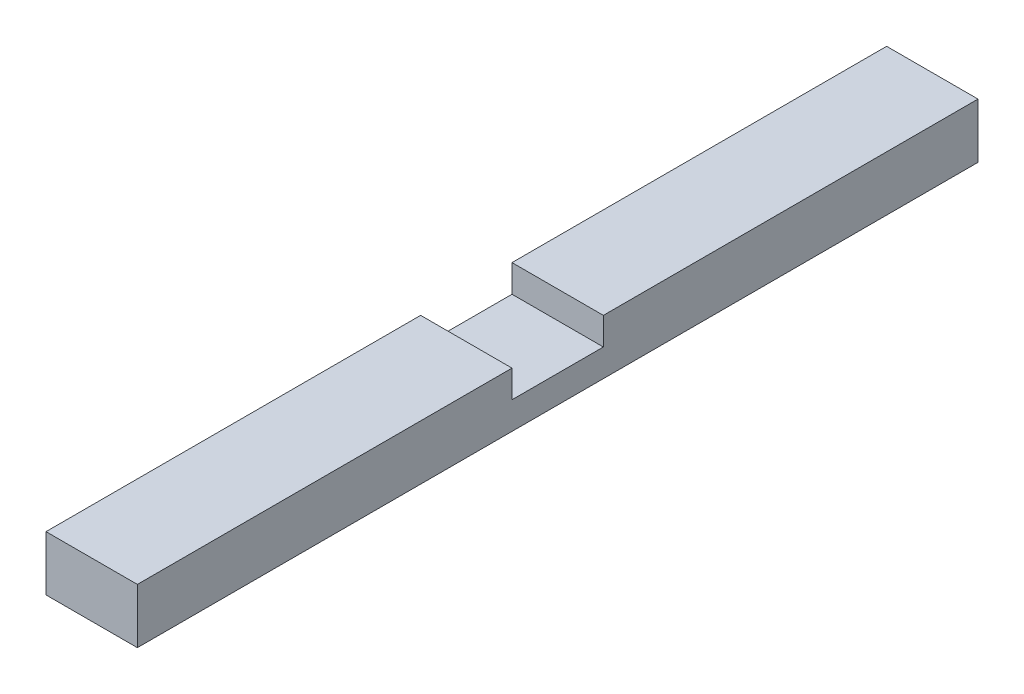
ISO-10303-21;
HEADER;
FILE_DESCRIPTION(('STEP AP214'),'2;1');
FILE_NAME('part.step','',(''),(''),'','','');
FILE_SCHEMA(('AUTOMOTIVE_DESIGN { 1 0 10303 214 1 1 1 1 }'));
ENDSEC;
DATA;
#1=APPLICATION_CONTEXT('core data for automotive mechanical design processes');
#2=APPLICATION_PROTOCOL_DEFINITION('international standard','automotive_design',2000,#1);
#3=PRODUCT_CONTEXT('',#1,'mechanical');
#4=PRODUCT('Part','Part','',(#3));
#5=PRODUCT_RELATED_PRODUCT_CATEGORY('part','',(#4));
#6=PRODUCT_DEFINITION_FORMATION('','',#4);
#7=PRODUCT_DEFINITION_CONTEXT('part definition',#1,'design');
#8=PRODUCT_DEFINITION('design','',#6,#7);
#9=PRODUCT_DEFINITION_SHAPE('','',#8);
#10=(LENGTH_UNIT() NAMED_UNIT(*) SI_UNIT(.MILLI.,.METRE.));
#11=(NAMED_UNIT(*) PLANE_ANGLE_UNIT() SI_UNIT($,.RADIAN.));
#12=(NAMED_UNIT(*) SI_UNIT($,.STERADIAN.) SOLID_ANGLE_UNIT());
#13=UNCERTAINTY_MEASURE_WITH_UNIT(LENGTH_MEASURE(1.E-05),#10,'distance_accuracy_value','');
#14=(GEOMETRIC_REPRESENTATION_CONTEXT(3) GLOBAL_UNCERTAINTY_ASSIGNED_CONTEXT((#13)) GLOBAL_UNIT_ASSIGNED_CONTEXT((#10,
#11,#12)) REPRESENTATION_CONTEXT('',''));
#15=CARTESIAN_POINT('',(0.,0.,0.));
#16=DIRECTION('',(0.,0.,1.));
#17=DIRECTION('',(1.,0.,0.));
#18=AXIS2_PLACEMENT_3D('',#15,#16,#17);
#19=CARTESIAN_POINT('',(50.,30.,460.));
#20=DIRECTION('',(0.,-1.,0.));
#21=DIRECTION('',(1.,0.,0.));
#22=AXIS2_PLACEMENT_3D('',#19,#20,#21);
#23=PLANE('',#22);
#24=DIRECTION('',(0.,0.,-1.));
#25=VECTOR('',#24,1.);
#26=CARTESIAN_POINT('',(50.,30.,460.));
#27=LINE('',#26,#25);
#28=CARTESIAN_POINT('',(50.,30.,460.));
#29=VERTEX_POINT('',#28);
#30=CARTESIAN_POINT('',(50.,30.,50.));
#31=VERTEX_POINT('',#30);
#32=EDGE_CURVE('E156',#29,#31,#27,.T.);
#33=ORIENTED_EDGE('',*,*,#32,.T.);
#34=DIRECTION('',(1.,0.,0.));
#35=VECTOR('',#34,1.);
#36=CARTESIAN_POINT('',(-50.,30.,50.));
#37=LINE('',#36,#35);
#38=CARTESIAN_POINT('',(-50.,30.,50.));
#39=VERTEX_POINT('',#38);
#40=EDGE_CURVE('E126',#39,#31,#37,.T.);
#41=ORIENTED_EDGE('',*,*,#40,.F.);
#42=DIRECTION('',(0.,0.,-1.));
#43=VECTOR('',#42,1.);
#44=CARTESIAN_POINT('',(-50.,30.,460.));
#45=LINE('',#44,#43);
#46=CARTESIAN_POINT('',(-50.,30.,460.));
#47=VERTEX_POINT('',#46);
#48=EDGE_CURVE('E153',#47,#39,#45,.T.);
#49=ORIENTED_EDGE('',*,*,#48,.F.);
#50=DIRECTION('',(-1.,0.,0.));
#51=VECTOR('',#50,1.);
#52=CARTESIAN_POINT('',(50.,30.,460.));
#53=LINE('',#52,#51);
#54=EDGE_CURVE('E61',#29,#47,#53,.T.);
#55=ORIENTED_EDGE('',*,*,#54,.F.);
#56=EDGE_LOOP('',(#33,#41,#49,#55));
#57=FACE_BOUND('',#56,.T.);
#58=ADVANCED_FACE('F37',(#57),#23,.F.);
#59=CARTESIAN_POINT('',(-50.,30.,460.));
#60=DIRECTION('',(1.,0.,0.));
#61=DIRECTION('',(0.,1.,0.));
#62=AXIS2_PLACEMENT_3D('',#59,#60,#61);
#63=PLANE('',#62);
#64=ORIENTED_EDGE('',*,*,#48,.T.);
#65=DIRECTION('',(0.,1.,0.));
#66=VECTOR('',#65,1.);
#67=CARTESIAN_POINT('',(-50.,0.,50.));
#68=LINE('',#67,#66);
#69=CARTESIAN_POINT('',(-50.,0.,50.));
#70=VERTEX_POINT('',#69);
#71=EDGE_CURVE('E133',#70,#39,#68,.T.);
#72=ORIENTED_EDGE('',*,*,#71,.F.);
#73=DIRECTION('',(0.,0.,1.));
#74=VECTOR('',#73,1.);
#75=CARTESIAN_POINT('',(-50.,0.,50.));
#76=LINE('',#75,#74);
#77=CARTESIAN_POINT('',(-50.,0.,-50.));
#78=VERTEX_POINT('',#77);
#79=EDGE_CURVE('E116',#78,#70,#76,.T.);
#80=ORIENTED_EDGE('',*,*,#79,.F.);
#81=DIRECTION('',(0.,1.,0.));
#82=VECTOR('',#81,1.);
#83=CARTESIAN_POINT('',(-50.,0.,-50.));
#84=LINE('',#83,#82);
#85=CARTESIAN_POINT('',(-50.,30.,-50.));
#86=VERTEX_POINT('',#85);
#87=EDGE_CURVE('E113',#78,#86,#84,.T.);
#88=ORIENTED_EDGE('',*,*,#87,.T.);
#89=CARTESIAN_POINT('',(-50.,30.,-460.));
#90=VERTEX_POINT('',#89);
#91=EDGE_CURVE('E83',#86,#90,#45,.T.);
#92=ORIENTED_EDGE('',*,*,#91,.T.);
#93=DIRECTION('',(0.,-1.,0.));
#94=VECTOR('',#93,1.);
#95=CARTESIAN_POINT('',(-50.,30.,-460.));
#96=LINE('',#95,#94);
#97=CARTESIAN_POINT('',(-50.,-30.,-460.));
#98=VERTEX_POINT('',#97);
#99=EDGE_CURVE('E145',#90,#98,#96,.T.);
#100=ORIENTED_EDGE('',*,*,#99,.T.);
#101=DIRECTION('',(0.,0.,-1.));
#102=VECTOR('',#101,1.);
#103=CARTESIAN_POINT('',(-50.,-30.,460.));
#104=LINE('',#103,#102);
#105=CARTESIAN_POINT('',(-50.,-30.,460.));
#106=VERTEX_POINT('',#105);
#107=EDGE_CURVE('E11',#106,#98,#104,.T.);
#108=ORIENTED_EDGE('',*,*,#107,.F.);
#109=DIRECTION('',(0.,-1.,0.));
#110=VECTOR('',#109,1.);
#111=CARTESIAN_POINT('',(-50.,30.,460.));
#112=LINE('',#111,#110);
#113=EDGE_CURVE('E138',#47,#106,#112,.T.);
#114=ORIENTED_EDGE('',*,*,#113,.F.);
#115=EDGE_LOOP('',(#64,#72,#80,#88,#92,#100,#108,#114));
#116=FACE_BOUND('',#115,.T.);
#117=ADVANCED_FACE('F39',(#116),#63,.F.);
#118=CARTESIAN_POINT('',(50.,-30.,460.));
#119=DIRECTION('',(0.,1.,0.));
#120=DIRECTION('',(-1.,0.,0.));
#121=AXIS2_PLACEMENT_3D('',#118,#119,#120);
#122=PLANE('',#121);
#123=DIRECTION('',(1.,0.,0.));
#124=VECTOR('',#123,1.);
#125=CARTESIAN_POINT('',(50.,-30.,-460.));
#126=LINE('',#125,#124);
#127=CARTESIAN_POINT('',(50.,-30.,-460.));
#128=VERTEX_POINT('',#127);
#129=EDGE_CURVE('E147',#98,#128,#126,.T.);
#130=ORIENTED_EDGE('',*,*,#129,.T.);
#131=DIRECTION('',(0.,0.,-1.));
#132=VECTOR('',#131,1.);
#133=CARTESIAN_POINT('',(50.,-30.,460.));
#134=LINE('',#133,#132);
#135=CARTESIAN_POINT('',(50.,-30.,460.));
#136=VERTEX_POINT('',#135);
#137=EDGE_CURVE('E45',#136,#128,#134,.T.);
#138=ORIENTED_EDGE('',*,*,#137,.F.);
#139=DIRECTION('',(1.,0.,0.));
#140=VECTOR('',#139,1.);
#141=CARTESIAN_POINT('',(50.,-30.,460.));
#142=LINE('',#141,#140);
#143=EDGE_CURVE('E90',#106,#136,#142,.T.);
#144=ORIENTED_EDGE('',*,*,#143,.F.);
#145=ORIENTED_EDGE('',*,*,#107,.T.);
#146=EDGE_LOOP('',(#130,#138,#144,#145));
#147=FACE_BOUND('',#146,.T.);
#148=ADVANCED_FACE('F196',(#147),#122,.F.);
#149=CARTESIAN_POINT('',(50.,30.,460.));
#150=DIRECTION('',(-1.,0.,0.));
#151=DIRECTION('',(0.,-1.,0.));
#152=AXIS2_PLACEMENT_3D('',#149,#150,#151);
#153=PLANE('',#152);
#154=DIRECTION('',(0.,0.,-1.));
#155=VECTOR('',#154,1.);
#156=CARTESIAN_POINT('',(50.,0.,50.));
#157=LINE('',#156,#155);
#158=CARTESIAN_POINT('',(50.,0.,50.));
#159=VERTEX_POINT('',#158);
#160=CARTESIAN_POINT('',(50.,0.,-50.));
#161=VERTEX_POINT('',#160);
#162=EDGE_CURVE('E117',#159,#161,#157,.T.);
#163=ORIENTED_EDGE('',*,*,#162,.F.);
#164=DIRECTION('',(0.,1.,0.));
#165=VECTOR('',#164,1.);
#166=CARTESIAN_POINT('',(50.,0.,50.));
#167=LINE('',#166,#165);
#168=EDGE_CURVE('E148',#159,#31,#167,.T.);
#169=ORIENTED_EDGE('',*,*,#168,.T.);
#170=ORIENTED_EDGE('',*,*,#32,.F.);
#171=DIRECTION('',(0.,1.,0.));
#172=VECTOR('',#171,1.);
#173=CARTESIAN_POINT('',(50.,30.,460.));
#174=LINE('',#173,#172);
#175=EDGE_CURVE('E142',#136,#29,#174,.T.);
#176=ORIENTED_EDGE('',*,*,#175,.F.);
#177=ORIENTED_EDGE('',*,*,#137,.T.);
#178=DIRECTION('',(0.,1.,0.));
#179=VECTOR('',#178,1.);
#180=CARTESIAN_POINT('',(50.,30.,-460.));
#181=LINE('',#180,#179);
#182=CARTESIAN_POINT('',(50.,30.,-460.));
#183=VERTEX_POINT('',#182);
#184=EDGE_CURVE('E150',#128,#183,#181,.T.);
#185=ORIENTED_EDGE('',*,*,#184,.T.);
#186=CARTESIAN_POINT('',(50.,30.,-50.));
#187=VERTEX_POINT('',#186);
#188=EDGE_CURVE('E131',#187,#183,#27,.T.);
#189=ORIENTED_EDGE('',*,*,#188,.F.);
#190=DIRECTION('',(0.,1.,0.));
#191=VECTOR('',#190,1.);
#192=CARTESIAN_POINT('',(50.,0.,-50.));
#193=LINE('',#192,#191);
#194=EDGE_CURVE('E52',#161,#187,#193,.T.);
#195=ORIENTED_EDGE('',*,*,#194,.F.);
#196=EDGE_LOOP('',(#163,#169,#170,#176,#177,#185,#189,#195));
#197=FACE_BOUND('',#196,.T.);
#198=ADVANCED_FACE('F129',(#197),#153,.F.);
#199=ORIENTED_EDGE('',*,*,#91,.F.);
#200=DIRECTION('',(-1.,0.,0.));
#201=VECTOR('',#200,1.);
#202=CARTESIAN_POINT('',(-50.,30.,-50.));
#203=LINE('',#202,#201);
#204=EDGE_CURVE('E168',#187,#86,#203,.T.);
#205=ORIENTED_EDGE('',*,*,#204,.F.);
#206=ORIENTED_EDGE('',*,*,#188,.T.);
#207=DIRECTION('',(-1.,0.,0.));
#208=VECTOR('',#207,1.);
#209=CARTESIAN_POINT('',(50.,30.,-460.));
#210=LINE('',#209,#208);
#211=EDGE_CURVE('E140',#183,#90,#210,.T.);
#212=ORIENTED_EDGE('',*,*,#211,.T.);
#213=EDGE_LOOP('',(#199,#205,#206,#212));
#214=FACE_BOUND('',#213,.T.);
#215=ADVANCED_FACE('F167',(#214),#23,.F.);
#216=CARTESIAN_POINT('',(0.,0.,460.));
#217=DIRECTION('',(0.,0.,-1.));
#218=DIRECTION('',(-1.,0.,0.));
#219=AXIS2_PLACEMENT_3D('',#216,#217,#218);
#220=PLANE('',#219);
#221=ORIENTED_EDGE('',*,*,#113,.T.);
#222=ORIENTED_EDGE('',*,*,#143,.T.);
#223=ORIENTED_EDGE('',*,*,#175,.T.);
#224=ORIENTED_EDGE('',*,*,#54,.T.);
#225=EDGE_LOOP('',(#221,#222,#223,#224));
#226=FACE_BOUND('',#225,.T.);
#227=ADVANCED_FACE('F180',(#226),#220,.F.);
#228=CARTESIAN_POINT('',(0.,0.,-460.));
#229=DIRECTION('',(0.,0.,-1.));
#230=DIRECTION('',(-1.,0.,0.));
#231=AXIS2_PLACEMENT_3D('',#228,#229,#230);
#232=PLANE('',#231);
#233=ORIENTED_EDGE('',*,*,#99,.F.);
#234=ORIENTED_EDGE('',*,*,#211,.F.);
#235=ORIENTED_EDGE('',*,*,#184,.F.);
#236=ORIENTED_EDGE('',*,*,#129,.F.);
#237=EDGE_LOOP('',(#233,#234,#235,#236));
#238=FACE_BOUND('',#237,.T.);
#239=ADVANCED_FACE('F165',(#238),#232,.T.);
#240=CARTESIAN_POINT('',(-50.,0.,50.));
#241=DIRECTION('',(0.,0.,1.));
#242=DIRECTION('',(1.,0.,0.));
#243=AXIS2_PLACEMENT_3D('',#240,#241,#242);
#244=PLANE('',#243);
#245=ORIENTED_EDGE('',*,*,#40,.T.);
#246=ORIENTED_EDGE('',*,*,#168,.F.);
#247=DIRECTION('',(1.,0.,0.));
#248=VECTOR('',#247,1.);
#249=CARTESIAN_POINT('',(-50.,0.,50.));
#250=LINE('',#249,#248);
#251=EDGE_CURVE('E123',#70,#159,#250,.T.);
#252=ORIENTED_EDGE('',*,*,#251,.F.);
#253=ORIENTED_EDGE('',*,*,#71,.T.);
#254=EDGE_LOOP('',(#245,#246,#252,#253));
#255=FACE_BOUND('',#254,.T.);
#256=ADVANCED_FACE('F176',(#255),#244,.F.);
#257=CARTESIAN_POINT('',(-50.,0.,-50.));
#258=DIRECTION('',(0.,0.,-1.));
#259=DIRECTION('',(-1.,0.,0.));
#260=AXIS2_PLACEMENT_3D('',#257,#258,#259);
#261=PLANE('',#260);
#262=ORIENTED_EDGE('',*,*,#204,.T.);
#263=ORIENTED_EDGE('',*,*,#87,.F.);
#264=DIRECTION('',(-1.,0.,0.));
#265=VECTOR('',#264,1.);
#266=CARTESIAN_POINT('',(-50.,0.,-50.));
#267=LINE('',#266,#265);
#268=EDGE_CURVE('E110',#161,#78,#267,.T.);
#269=ORIENTED_EDGE('',*,*,#268,.F.);
#270=ORIENTED_EDGE('',*,*,#194,.T.);
#271=EDGE_LOOP('',(#262,#263,#269,#270));
#272=FACE_BOUND('',#271,.T.);
#273=ADVANCED_FACE('F112',(#272),#261,.F.);
#274=CARTESIAN_POINT('',(0.,0.,0.));
#275=DIRECTION('',(0.,-1.,0.));
#276=DIRECTION('',(1.,0.,0.));
#277=AXIS2_PLACEMENT_3D('',#274,#275,#276);
#278=PLANE('',#277);
#279=ORIENTED_EDGE('',*,*,#162,.T.);
#280=ORIENTED_EDGE('',*,*,#268,.T.);
#281=ORIENTED_EDGE('',*,*,#79,.T.);
#282=ORIENTED_EDGE('',*,*,#251,.T.);
#283=EDGE_LOOP('',(#279,#280,#281,#282));
#284=FACE_BOUND('',#283,.T.);
#285=ADVANCED_FACE('F121',(#284),#278,.F.);
#286=CLOSED_SHELL('',(#58,#117,#148,#198,#215,#227,#239,#256,#273,#285));
#287=MANIFOLD_SOLID_BREP('B2',#286);
#288=ADVANCED_BREP_SHAPE_REPRESENTATION('',(#18,#287),#14);
#289=SHAPE_DEFINITION_REPRESENTATION(#9,#288);
ENDSEC;
END-ISO-10303-21;
